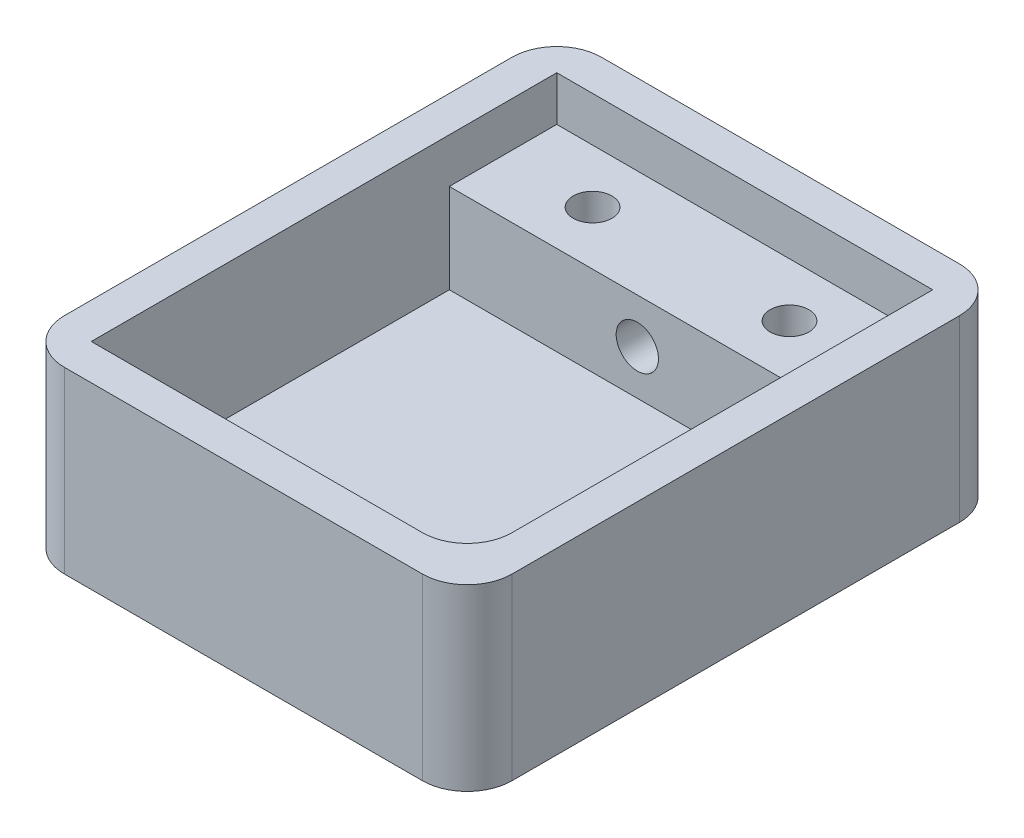
ISO-10303-21;
HEADER;
FILE_DESCRIPTION(('STEP AP214'),'2;1');
FILE_NAME('part.step','',(''),(''),'','','');
FILE_SCHEMA(('AUTOMOTIVE_DESIGN { 1 0 10303 214 1 1 1 1 }'));
ENDSEC;
DATA;
#1=APPLICATION_CONTEXT('core data for automotive mechanical design processes');
#2=APPLICATION_PROTOCOL_DEFINITION('international standard','automotive_design',2000,#1);
#3=PRODUCT_CONTEXT('',#1,'mechanical');
#4=PRODUCT('Part','Part','',(#3));
#5=PRODUCT_RELATED_PRODUCT_CATEGORY('part','',(#4));
#6=PRODUCT_DEFINITION_FORMATION('','',#4);
#7=PRODUCT_DEFINITION_CONTEXT('part definition',#1,'design');
#8=PRODUCT_DEFINITION('design','',#6,#7);
#9=PRODUCT_DEFINITION_SHAPE('','',#8);
#10=(LENGTH_UNIT() NAMED_UNIT(*) SI_UNIT(.MILLI.,.METRE.));
#11=(NAMED_UNIT(*) PLANE_ANGLE_UNIT() SI_UNIT($,.RADIAN.));
#12=(NAMED_UNIT(*) SI_UNIT($,.STERADIAN.) SOLID_ANGLE_UNIT());
#13=UNCERTAINTY_MEASURE_WITH_UNIT(LENGTH_MEASURE(1.E-05),#10,'distance_accuracy_value','');
#14=(GEOMETRIC_REPRESENTATION_CONTEXT(3) GLOBAL_UNCERTAINTY_ASSIGNED_CONTEXT((#13)) GLOBAL_UNIT_ASSIGNED_CONTEXT((#10,
#11,#12)) REPRESENTATION_CONTEXT('',''));
#15=CARTESIAN_POINT('',(0.,0.,0.));
#16=DIRECTION('',(0.,0.,1.));
#17=DIRECTION('',(1.,0.,0.));
#18=AXIS2_PLACEMENT_3D('',#15,#16,#17);
#19=CARTESIAN_POINT('',(13.335,12.7,16.51));
#20=DIRECTION('',(-1.,0.,0.));
#21=DIRECTION('',(0.,0.,1.));
#22=AXIS2_PLACEMENT_3D('',#19,#20,#21);
#23=PLANE('',#22);
#24=DIRECTION('',(0.,0.,-1.));
#25=VECTOR('',#24,1.);
#26=CARTESIAN_POINT('',(13.335,3.175,16.51));
#27=LINE('',#26,#25);
#28=CARTESIAN_POINT('',(13.335,3.175,13.335));
#29=VERTEX_POINT('',#28);
#30=CARTESIAN_POINT('',(13.335,3.175,-8.89000000000001));
#31=VERTEX_POINT('',#30);
#32=EDGE_CURVE('E142',#29,#31,#27,.T.);
#33=ORIENTED_EDGE('',*,*,#32,.F.);
#34=DIRECTION('',(0.,-1.,0.));
#35=VECTOR('',#34,1.);
#36=CARTESIAN_POINT('',(13.335,12.7,13.335));
#37=LINE('',#36,#35);
#38=CARTESIAN_POINT('',(13.335,12.7,13.335));
#39=VERTEX_POINT('',#38);
#40=EDGE_CURVE('E298',#29,#39,#37,.F.);
#41=ORIENTED_EDGE('',*,*,#40,.T.);
#42=DIRECTION('',(0.,0.,-1.));
#43=VECTOR('',#42,1.);
#44=CARTESIAN_POINT('',(13.335,12.7,16.51));
#45=LINE('',#44,#43);
#46=CARTESIAN_POINT('',(13.335,12.7,-16.51));
#47=VERTEX_POINT('',#46);
#48=EDGE_CURVE('E183',#39,#47,#45,.T.);
#49=ORIENTED_EDGE('',*,*,#48,.T.);
#50=DIRECTION('',(0.,-1.,0.));
#51=VECTOR('',#50,1.);
#52=CARTESIAN_POINT('',(13.335,12.7,-16.51));
#53=LINE('',#52,#51);
#54=CARTESIAN_POINT('',(13.335,9.525,-16.51));
#55=VERTEX_POINT('',#54);
#56=EDGE_CURVE('E210',#47,#55,#53,.T.);
#57=ORIENTED_EDGE('',*,*,#56,.T.);
#58=DIRECTION('',(0.,0.,-1.));
#59=VECTOR('',#58,1.);
#60=CARTESIAN_POINT('',(13.335,9.525,-16.51));
#61=LINE('',#60,#59);
#62=CARTESIAN_POINT('',(13.335,9.525,-8.89000000000001));
#63=VERTEX_POINT('',#62);
#64=EDGE_CURVE('E157',#63,#55,#61,.T.);
#65=ORIENTED_EDGE('',*,*,#64,.F.);
#66=DIRECTION('',(0.,-1.,0.));
#67=VECTOR('',#66,1.);
#68=CARTESIAN_POINT('',(13.335,9.525,-8.89000000000001));
#69=LINE('',#68,#67);
#70=EDGE_CURVE('E154',#63,#31,#69,.T.);
#71=ORIENTED_EDGE('',*,*,#70,.T.);
#72=EDGE_LOOP('',(#33,#41,#49,#57,#65,#71));
#73=FACE_BOUND('',#72,.T.);
#74=ADVANCED_FACE('F38',(#73),#23,.T.);
#75=CARTESIAN_POINT('',(-13.335,12.7,16.51));
#76=DIRECTION('',(1.,0.,0.));
#77=DIRECTION('',(0.,0.,-1.));
#78=AXIS2_PLACEMENT_3D('',#75,#76,#77);
#79=PLANE('',#78);
#80=DIRECTION('',(0.,0.,1.));
#81=VECTOR('',#80,1.);
#82=CARTESIAN_POINT('',(-13.335,3.175,16.51));
#83=LINE('',#82,#81);
#84=CARTESIAN_POINT('',(-13.335,3.175,-8.89000000000001));
#85=VERTEX_POINT('',#84);
#86=CARTESIAN_POINT('',(-13.335,3.175,16.51));
#87=VERTEX_POINT('',#86);
#88=EDGE_CURVE('E150',#85,#87,#83,.T.);
#89=ORIENTED_EDGE('',*,*,#88,.F.);
#90=DIRECTION('',(0.,-1.,0.));
#91=VECTOR('',#90,1.);
#92=CARTESIAN_POINT('',(-13.335,9.525,-8.89000000000001));
#93=LINE('',#92,#91);
#94=CARTESIAN_POINT('',(-13.335,9.525,-8.89000000000001));
#95=VERTEX_POINT('',#94);
#96=EDGE_CURVE('E151',#95,#85,#93,.T.);
#97=ORIENTED_EDGE('',*,*,#96,.F.);
#98=DIRECTION('',(0.,0.,1.));
#99=VECTOR('',#98,1.);
#100=CARTESIAN_POINT('',(-13.335,9.525,-16.51));
#101=LINE('',#100,#99);
#102=CARTESIAN_POINT('',(-13.335,9.525,-16.51));
#103=VERTEX_POINT('',#102);
#104=EDGE_CURVE('E167',#103,#95,#101,.T.);
#105=ORIENTED_EDGE('',*,*,#104,.F.);
#106=DIRECTION('',(0.,-1.,0.));
#107=VECTOR('',#106,1.);
#108=CARTESIAN_POINT('',(-13.335,12.7,-16.51));
#109=LINE('',#108,#107);
#110=CARTESIAN_POINT('',(-13.335,12.7,-16.51));
#111=VERTEX_POINT('',#110);
#112=EDGE_CURVE('E206',#111,#103,#109,.T.);
#113=ORIENTED_EDGE('',*,*,#112,.F.);
#114=DIRECTION('',(0.,0.,1.));
#115=VECTOR('',#114,1.);
#116=CARTESIAN_POINT('',(-13.335,12.7,16.51));
#117=LINE('',#116,#115);
#118=CARTESIAN_POINT('',(-13.335,12.7,16.51));
#119=VERTEX_POINT('',#118);
#120=EDGE_CURVE('E190',#111,#119,#117,.T.);
#121=ORIENTED_EDGE('',*,*,#120,.T.);
#122=DIRECTION('',(0.,-1.,0.));
#123=VECTOR('',#122,1.);
#124=CARTESIAN_POINT('',(-13.335,12.7,16.51));
#125=LINE('',#124,#123);
#126=EDGE_CURVE('E197',#119,#87,#125,.T.);
#127=ORIENTED_EDGE('',*,*,#126,.T.);
#128=EDGE_LOOP('',(#89,#97,#105,#113,#121,#127));
#129=FACE_BOUND('',#128,.T.);
#130=ADVANCED_FACE('F357',(#129),#79,.T.);
#131=CARTESIAN_POINT('',(0.,3.175,0.));
#132=DIRECTION('',(0.,-1.,0.));
#133=DIRECTION('',(0.,0.,-1.));
#134=AXIS2_PLACEMENT_3D('',#131,#132,#133);
#135=PLANE('',#134);
#136=DIRECTION('',(1.,0.,0.));
#137=VECTOR('',#136,1.);
#138=CARTESIAN_POINT('',(-13.335,3.175,16.51));
#139=LINE('',#138,#137);
#140=CARTESIAN_POINT('',(10.16,3.175,16.51));
#141=VERTEX_POINT('',#140);
#142=EDGE_CURVE('E187',#87,#141,#139,.T.);
#143=ORIENTED_EDGE('',*,*,#142,.T.);
#144=CARTESIAN_POINT('',(10.16,3.175,13.335));
#145=DIRECTION('',(0.,-1.,0.));
#146=DIRECTION('',(0.,0.,-1.));
#147=AXIS2_PLACEMENT_3D('',#144,#145,#146);
#148=CIRCLE('',#147,3.175);
#149=EDGE_CURVE('E54',#141,#29,#148,.F.);
#150=ORIENTED_EDGE('',*,*,#149,.T.);
#151=ORIENTED_EDGE('',*,*,#32,.T.);
#152=DIRECTION('',(1.,0.,0.));
#153=VECTOR('',#152,1.);
#154=CARTESIAN_POINT('',(-13.335,3.175,-8.89000000000001));
#155=LINE('',#154,#153);
#156=EDGE_CURVE('E146',#85,#31,#155,.T.);
#157=ORIENTED_EDGE('',*,*,#156,.F.);
#158=ORIENTED_EDGE('',*,*,#88,.T.);
#159=EDGE_LOOP('',(#143,#150,#151,#157,#158));
#160=FACE_BOUND('',#159,.T.);
#161=ADVANCED_FACE('F144',(#160),#135,.F.);
#162=CARTESIAN_POINT('',(15.875,3.175,19.05));
#163=DIRECTION('',(-1.,0.,0.));
#164=DIRECTION('',(0.,0.,1.));
#165=AXIS2_PLACEMENT_3D('',#162,#163,#164);
#166=PLANE('',#165);
#167=DIRECTION('',(0.,0.,-1.));
#168=VECTOR('',#167,1.);
#169=CARTESIAN_POINT('',(15.875,12.7,19.05));
#170=LINE('',#169,#168);
#171=CARTESIAN_POINT('',(15.875,12.7,15.875));
#172=VERTEX_POINT('',#171);
#173=CARTESIAN_POINT('',(15.875,12.7,-15.875));
#174=VERTEX_POINT('',#173);
#175=EDGE_CURVE('E217',#172,#174,#170,.T.);
#176=ORIENTED_EDGE('',*,*,#175,.F.);
#177=DIRECTION('',(0.,-1.,0.));
#178=VECTOR('',#177,1.);
#179=CARTESIAN_POINT('',(15.875,3.175,15.875));
#180=LINE('',#179,#178);
#181=CARTESIAN_POINT('',(15.875,0.,15.875));
#182=VERTEX_POINT('',#181);
#183=EDGE_CURVE('E258',#172,#182,#180,.T.);
#184=ORIENTED_EDGE('',*,*,#183,.T.);
#185=DIRECTION('',(0.,0.,-1.));
#186=VECTOR('',#185,1.);
#187=CARTESIAN_POINT('',(15.875,0.,19.05));
#188=LINE('',#187,#186);
#189=CARTESIAN_POINT('',(15.875,0.,-15.875));
#190=VERTEX_POINT('',#189);
#191=EDGE_CURVE('E229',#182,#190,#188,.T.);
#192=ORIENTED_EDGE('',*,*,#191,.T.);
#193=DIRECTION('',(0.,-1.,0.));
#194=VECTOR('',#193,1.);
#195=CARTESIAN_POINT('',(15.875,3.175,-15.875));
#196=LINE('',#195,#194);
#197=EDGE_CURVE('E245',#190,#174,#196,.F.);
#198=ORIENTED_EDGE('',*,*,#197,.T.);
#199=EDGE_LOOP('',(#176,#184,#192,#198));
#200=FACE_BOUND('',#199,.T.);
#201=ADVANCED_FACE('F349',(#200),#166,.F.);
#202=CARTESIAN_POINT('',(-15.875,3.175,-19.05));
#203=DIRECTION('',(0.,0.,1.));
#204=DIRECTION('',(1.,0.,0.));
#205=AXIS2_PLACEMENT_3D('',#202,#203,#204);
#206=PLANE('',#205);
#207=CARTESIAN_POINT('',(0.,6.35,-19.05));
#208=DIRECTION('',(0.,0.,1.));
#209=DIRECTION('',(1.,0.,0.));
#210=AXIS2_PLACEMENT_3D('',#207,#208,#209);
#211=CIRCLE('',#210,1.5);
#212=CARTESIAN_POINT('',(1.5,6.35,-19.05));
#213=VERTEX_POINT('',#212);
#214=EDGE_CURVE('E602',#213,#213,#211,.T.);
#215=ORIENTED_EDGE('',*,*,#214,.T.);
#216=EDGE_LOOP('',(#215));
#217=FACE_BOUND('',#216,.T.);
#218=DIRECTION('',(-1.,0.,0.));
#219=VECTOR('',#218,1.);
#220=CARTESIAN_POINT('',(-15.875,0.,-19.05));
#221=LINE('',#220,#219);
#222=CARTESIAN_POINT('',(12.7,0.,-19.05));
#223=VERTEX_POINT('',#222);
#224=CARTESIAN_POINT('',(-12.7,0.,-19.05));
#225=VERTEX_POINT('',#224);
#226=EDGE_CURVE('E233',#223,#225,#221,.T.);
#227=ORIENTED_EDGE('',*,*,#226,.T.);
#228=DIRECTION('',(0.,-1.,0.));
#229=VECTOR('',#228,1.);
#230=CARTESIAN_POINT('',(-12.7,3.175,-19.05));
#231=LINE('',#230,#229);
#232=CARTESIAN_POINT('',(-12.7,12.7,-19.05));
#233=VERTEX_POINT('',#232);
#234=EDGE_CURVE('E47',#225,#233,#231,.F.);
#235=ORIENTED_EDGE('',*,*,#234,.T.);
#236=DIRECTION('',(-1.,0.,0.));
#237=VECTOR('',#236,1.);
#238=CARTESIAN_POINT('',(15.875,12.7,-19.05));
#239=LINE('',#238,#237);
#240=CARTESIAN_POINT('',(12.7,12.7,-19.05));
#241=VERTEX_POINT('',#240);
#242=EDGE_CURVE('E221',#241,#233,#239,.T.);
#243=ORIENTED_EDGE('',*,*,#242,.F.);
#244=DIRECTION('',(0.,-1.,0.));
#245=VECTOR('',#244,1.);
#246=CARTESIAN_POINT('',(12.7,3.175,-19.05));
#247=LINE('',#246,#245);
#248=EDGE_CURVE('E308',#241,#223,#247,.T.);
#249=ORIENTED_EDGE('',*,*,#248,.T.);
#250=EDGE_LOOP('',(#227,#235,#243,#249));
#251=FACE_BOUND('',#250,.T.);
#252=ADVANCED_FACE('F315',(#217,#251),#206,.F.);
#253=CARTESIAN_POINT('',(-15.875,3.175,19.05));
#254=DIRECTION('',(1.,0.,0.));
#255=DIRECTION('',(0.,0.,-1.));
#256=AXIS2_PLACEMENT_3D('',#253,#254,#255);
#257=PLANE('',#256);
#258=DIRECTION('',(0.,0.,1.));
#259=VECTOR('',#258,1.);
#260=CARTESIAN_POINT('',(-15.875,0.,19.05));
#261=LINE('',#260,#259);
#262=CARTESIAN_POINT('',(-15.875,0.,-15.875));
#263=VERTEX_POINT('',#262);
#264=CARTESIAN_POINT('',(-15.875,0.,15.875));
#265=VERTEX_POINT('',#264);
#266=EDGE_CURVE('E237',#263,#265,#261,.T.);
#267=ORIENTED_EDGE('',*,*,#266,.T.);
#268=DIRECTION('',(0.,-1.,0.));
#269=VECTOR('',#268,1.);
#270=CARTESIAN_POINT('',(-15.875,3.175,15.875));
#271=LINE('',#270,#269);
#272=CARTESIAN_POINT('',(-15.875,12.7,15.875));
#273=VERTEX_POINT('',#272);
#274=EDGE_CURVE('E305',#265,#273,#271,.F.);
#275=ORIENTED_EDGE('',*,*,#274,.T.);
#276=DIRECTION('',(0.,0.,1.));
#277=VECTOR('',#276,1.);
#278=CARTESIAN_POINT('',(-15.875,12.7,-19.05));
#279=LINE('',#278,#277);
#280=CARTESIAN_POINT('',(-15.875,12.7,-15.875));
#281=VERTEX_POINT('',#280);
#282=EDGE_CURVE('E225',#281,#273,#279,.T.);
#283=ORIENTED_EDGE('',*,*,#282,.F.);
#284=DIRECTION('',(0.,-1.,0.));
#285=VECTOR('',#284,1.);
#286=CARTESIAN_POINT('',(-15.875,3.175,-15.875));
#287=LINE('',#286,#285);
#288=EDGE_CURVE('E301',#281,#263,#287,.T.);
#289=ORIENTED_EDGE('',*,*,#288,.T.);
#290=EDGE_LOOP('',(#267,#275,#283,#289));
#291=FACE_BOUND('',#290,.T.);
#292=ADVANCED_FACE('F329',(#291),#257,.F.);
#293=CARTESIAN_POINT('',(-15.875,3.175,19.05));
#294=DIRECTION('',(0.,0.,-1.));
#295=DIRECTION('',(-1.,0.,0.));
#296=AXIS2_PLACEMENT_3D('',#293,#294,#295);
#297=PLANE('',#296);
#298=DIRECTION('',(1.,0.,0.));
#299=VECTOR('',#298,1.);
#300=CARTESIAN_POINT('',(-15.875,0.,19.05));
#301=LINE('',#300,#299);
#302=CARTESIAN_POINT('',(-12.7,0.,19.05));
#303=VERTEX_POINT('',#302);
#304=CARTESIAN_POINT('',(12.7,0.,19.05));
#305=VERTEX_POINT('',#304);
#306=EDGE_CURVE('E241',#303,#305,#301,.T.);
#307=ORIENTED_EDGE('',*,*,#306,.T.);
#308=DIRECTION('',(0.,-1.,0.));
#309=VECTOR('',#308,1.);
#310=CARTESIAN_POINT('',(12.7,3.175,19.05));
#311=LINE('',#310,#309);
#312=CARTESIAN_POINT('',(12.7,12.7,19.05));
#313=VERTEX_POINT('',#312);
#314=EDGE_CURVE('E278',#305,#313,#311,.F.);
#315=ORIENTED_EDGE('',*,*,#314,.T.);
#316=DIRECTION('',(1.,0.,0.));
#317=VECTOR('',#316,1.);
#318=CARTESIAN_POINT('',(-15.875,12.7,19.05));
#319=LINE('',#318,#317);
#320=CARTESIAN_POINT('',(-12.7,12.7,19.05));
#321=VERTEX_POINT('',#320);
#322=EDGE_CURVE('E213',#321,#313,#319,.T.);
#323=ORIENTED_EDGE('',*,*,#322,.F.);
#324=DIRECTION('',(0.,-1.,0.));
#325=VECTOR('',#324,1.);
#326=CARTESIAN_POINT('',(-12.7,3.175,19.05));
#327=LINE('',#326,#325);
#328=EDGE_CURVE('E274',#321,#303,#327,.T.);
#329=ORIENTED_EDGE('',*,*,#328,.T.);
#330=EDGE_LOOP('',(#307,#315,#323,#329));
#331=FACE_BOUND('',#330,.T.);
#332=ADVANCED_FACE('F341',(#331),#297,.F.);
#333=CARTESIAN_POINT('',(0.,0.,0.));
#334=DIRECTION('',(0.,-1.,0.));
#335=DIRECTION('',(0.,0.,-1.));
#336=AXIS2_PLACEMENT_3D('',#333,#334,#335);
#337=PLANE('',#336);
#338=CARTESIAN_POINT('',(-6.985,0.,-12.7));
#339=DIRECTION('',(0.,-1.,0.));
#340=DIRECTION('',(0.,0.,-1.));
#341=AXIS2_PLACEMENT_3D('',#338,#339,#340);
#342=CIRCLE('',#341,2.749999961);
#343=CARTESIAN_POINT('',(-6.985,0.,-15.449999961));
#344=VERTEX_POINT('',#343);
#345=EDGE_CURVE('E176',#344,#344,#342,.T.);
#346=ORIENTED_EDGE('',*,*,#345,.F.);
#347=EDGE_LOOP('',(#346));
#348=FACE_BOUND('',#347,.T.);
#349=CARTESIAN_POINT('',(6.985,0.,-12.7));
#350=DIRECTION('',(0.,-1.,0.));
#351=DIRECTION('',(0.,0.,-1.));
#352=AXIS2_PLACEMENT_3D('',#349,#350,#351);
#353=CIRCLE('',#352,2.749999961);
#354=CARTESIAN_POINT('',(6.985,0.,-15.449999961));
#355=VERTEX_POINT('',#354);
#356=EDGE_CURVE('E255',#355,#355,#353,.T.);
#357=ORIENTED_EDGE('',*,*,#356,.F.);
#358=EDGE_LOOP('',(#357));
#359=FACE_BOUND('',#358,.T.);
#360=ORIENTED_EDGE('',*,*,#191,.F.);
#361=CARTESIAN_POINT('',(12.7,0.,15.875));
#362=DIRECTION('',(0.,-1.,0.));
#363=DIRECTION('',(0.,0.,-1.));
#364=AXIS2_PLACEMENT_3D('',#361,#362,#363);
#365=CIRCLE('',#364,3.175);
#366=EDGE_CURVE('E271',#182,#305,#365,.T.);
#367=ORIENTED_EDGE('',*,*,#366,.T.);
#368=ORIENTED_EDGE('',*,*,#306,.F.);
#369=CARTESIAN_POINT('',(-12.7,0.,15.875));
#370=DIRECTION('',(0.,-1.,0.));
#371=DIRECTION('',(0.,0.,-1.));
#372=AXIS2_PLACEMENT_3D('',#369,#370,#371);
#373=CIRCLE('',#372,3.175);
#374=EDGE_CURVE('E268',#303,#265,#373,.T.);
#375=ORIENTED_EDGE('',*,*,#374,.T.);
#376=ORIENTED_EDGE('',*,*,#266,.F.);
#377=CARTESIAN_POINT('',(-12.7,0.,-15.875));
#378=DIRECTION('',(0.,-1.,0.));
#379=DIRECTION('',(0.,0.,-1.));
#380=AXIS2_PLACEMENT_3D('',#377,#378,#379);
#381=CIRCLE('',#380,3.175);
#382=EDGE_CURVE('E265',#263,#225,#381,.T.);
#383=ORIENTED_EDGE('',*,*,#382,.T.);
#384=ORIENTED_EDGE('',*,*,#226,.F.);
#385=CARTESIAN_POINT('',(12.7,0.,-15.875));
#386=DIRECTION('',(0.,-1.,0.));
#387=DIRECTION('',(0.,0.,-1.));
#388=AXIS2_PLACEMENT_3D('',#385,#386,#387);
#389=CIRCLE('',#388,3.175);
#390=EDGE_CURVE('E262',#223,#190,#389,.T.);
#391=ORIENTED_EDGE('',*,*,#390,.T.);
#392=EDGE_LOOP('',(#360,#367,#368,#375,#376,#383,#384,#391));
#393=FACE_BOUND('',#392,.T.);
#394=ADVANCED_FACE('F333',(#348,#359,#393),#337,.T.);
#395=CARTESIAN_POINT('',(0.,12.7,0.));
#396=DIRECTION('',(0.,1.,0.));
#397=DIRECTION('',(0.,0.,1.));
#398=AXIS2_PLACEMENT_3D('',#395,#396,#397);
#399=PLANE('',#398);
#400=ORIENTED_EDGE('',*,*,#322,.T.);
#401=CARTESIAN_POINT('',(12.7,12.7,15.875));
#402=DIRECTION('',(0.,1.,0.));
#403=DIRECTION('',(0.,0.,1.));
#404=AXIS2_PLACEMENT_3D('',#401,#402,#403);
#405=CIRCLE('',#404,3.175);
#406=EDGE_CURVE('E290',#313,#172,#405,.T.);
#407=ORIENTED_EDGE('',*,*,#406,.T.);
#408=ORIENTED_EDGE('',*,*,#175,.T.);
#409=CARTESIAN_POINT('',(12.7,12.7,-15.875));
#410=DIRECTION('',(0.,1.,0.));
#411=DIRECTION('',(0.,0.,1.));
#412=AXIS2_PLACEMENT_3D('',#409,#410,#411);
#413=CIRCLE('',#412,3.175);
#414=EDGE_CURVE('E281',#174,#241,#413,.T.);
#415=ORIENTED_EDGE('',*,*,#414,.T.);
#416=ORIENTED_EDGE('',*,*,#242,.T.);
#417=CARTESIAN_POINT('',(-12.7,12.7,-15.875));
#418=DIRECTION('',(0.,1.,0.));
#419=DIRECTION('',(0.,0.,1.));
#420=AXIS2_PLACEMENT_3D('',#417,#418,#419);
#421=CIRCLE('',#420,3.175);
#422=EDGE_CURVE('E284',#233,#281,#421,.T.);
#423=ORIENTED_EDGE('',*,*,#422,.T.);
#424=ORIENTED_EDGE('',*,*,#282,.T.);
#425=CARTESIAN_POINT('',(-12.7,12.7,15.875));
#426=DIRECTION('',(0.,1.,0.));
#427=DIRECTION('',(0.,0.,1.));
#428=AXIS2_PLACEMENT_3D('',#425,#426,#427);
#429=CIRCLE('',#428,3.175);
#430=EDGE_CURVE('E287',#273,#321,#429,.T.);
#431=ORIENTED_EDGE('',*,*,#430,.T.);
#432=EDGE_LOOP('',(#400,#407,#408,#415,#416,#423,#424,#431));
#433=FACE_BOUND('',#432,.T.);
#434=DIRECTION('',(-1.,0.,0.));
#435=VECTOR('',#434,1.);
#436=CARTESIAN_POINT('',(-13.335,12.7,-16.51));
#437=LINE('',#436,#435);
#438=EDGE_CURVE('E186',#47,#111,#437,.T.);
#439=ORIENTED_EDGE('',*,*,#438,.F.);
#440=ORIENTED_EDGE('',*,*,#48,.F.);
#441=CARTESIAN_POINT('',(10.16,12.7,13.335));
#442=DIRECTION('',(0.,1.,0.));
#443=DIRECTION('',(0.,0.,1.));
#444=AXIS2_PLACEMENT_3D('',#441,#442,#443);
#445=CIRCLE('',#444,3.175);
#446=CARTESIAN_POINT('',(10.16,12.7,16.51));
#447=VERTEX_POINT('',#446);
#448=EDGE_CURVE('E11',#39,#447,#445,.F.);
#449=ORIENTED_EDGE('',*,*,#448,.T.);
#450=DIRECTION('',(1.,0.,0.));
#451=VECTOR('',#450,1.);
#452=CARTESIAN_POINT('',(-13.335,12.7,16.51));
#453=LINE('',#452,#451);
#454=EDGE_CURVE('E194',#119,#447,#453,.T.);
#455=ORIENTED_EDGE('',*,*,#454,.F.);
#456=ORIENTED_EDGE('',*,*,#120,.F.);
#457=EDGE_LOOP('',(#439,#440,#449,#455,#456));
#458=FACE_BOUND('',#457,.T.);
#459=ADVANCED_FACE('F321',(#433,#458),#399,.T.);
#460=CARTESIAN_POINT('',(-13.335,12.7,-16.51));
#461=DIRECTION('',(0.,0.,1.));
#462=DIRECTION('',(1.,0.,0.));
#463=AXIS2_PLACEMENT_3D('',#460,#461,#462);
#464=PLANE('',#463);
#465=DIRECTION('',(-1.,0.,0.));
#466=VECTOR('',#465,1.);
#467=CARTESIAN_POINT('',(-13.335,9.525,-16.51));
#468=LINE('',#467,#466);
#469=EDGE_CURVE('E162',#55,#103,#468,.T.);
#470=ORIENTED_EDGE('',*,*,#469,.F.);
#471=ORIENTED_EDGE('',*,*,#56,.F.);
#472=ORIENTED_EDGE('',*,*,#438,.T.);
#473=ORIENTED_EDGE('',*,*,#112,.T.);
#474=EDGE_LOOP('',(#470,#471,#472,#473));
#475=FACE_BOUND('',#474,.T.);
#476=ADVANCED_FACE('F368',(#475),#464,.T.);
#477=CARTESIAN_POINT('',(-13.335,12.7,16.51));
#478=DIRECTION('',(0.,0.,-1.));
#479=DIRECTION('',(-1.,0.,0.));
#480=AXIS2_PLACEMENT_3D('',#477,#478,#479);
#481=PLANE('',#480);
#482=ORIENTED_EDGE('',*,*,#454,.T.);
#483=DIRECTION('',(0.,-1.,0.));
#484=VECTOR('',#483,1.);
#485=CARTESIAN_POINT('',(10.16,3.175,16.51));
#486=LINE('',#485,#484);
#487=EDGE_CURVE('E293',#447,#141,#486,.T.);
#488=ORIENTED_EDGE('',*,*,#487,.T.);
#489=ORIENTED_EDGE('',*,*,#142,.F.);
#490=ORIENTED_EDGE('',*,*,#126,.F.);
#491=EDGE_LOOP('',(#482,#488,#489,#490));
#492=FACE_BOUND('',#491,.T.);
#493=ADVANCED_FACE('F496',(#492),#481,.T.);
#494=CARTESIAN_POINT('',(-13.335,9.525,-8.89000000000001));
#495=DIRECTION('',(0.,0.,-1.));
#496=DIRECTION('',(-1.,0.,0.));
#497=AXIS2_PLACEMENT_3D('',#494,#495,#496);
#498=PLANE('',#497);
#499=CARTESIAN_POINT('',(0.,6.35,-8.89000000000001));
#500=DIRECTION('',(0.,0.,1.));
#501=DIRECTION('',(1.,0.,0.));
#502=AXIS2_PLACEMENT_3D('',#499,#500,#501);
#503=CIRCLE('',#502,1.5);
#504=CARTESIAN_POINT('',(1.5,6.35,-8.89000000000001));
#505=VERTEX_POINT('',#504);
#506=EDGE_CURVE('E606',#505,#505,#503,.T.);
#507=ORIENTED_EDGE('',*,*,#506,.F.);
#508=EDGE_LOOP('',(#507));
#509=FACE_BOUND('',#508,.T.);
#510=ORIENTED_EDGE('',*,*,#156,.T.);
#511=ORIENTED_EDGE('',*,*,#70,.F.);
#512=DIRECTION('',(1.,0.,0.));
#513=VECTOR('',#512,1.);
#514=CARTESIAN_POINT('',(-13.335,9.525,-8.89000000000001));
#515=LINE('',#514,#513);
#516=EDGE_CURVE('E173',#95,#63,#515,.T.);
#517=ORIENTED_EDGE('',*,*,#516,.F.);
#518=ORIENTED_EDGE('',*,*,#96,.T.);
#519=EDGE_LOOP('',(#510,#511,#517,#518));
#520=FACE_BOUND('',#519,.T.);
#521=ADVANCED_FACE('F165',(#509,#520),#498,.F.);
#522=CARTESIAN_POINT('',(0.,9.525,0.));
#523=DIRECTION('',(0.,1.,0.));
#524=DIRECTION('',(0.,0.,1.));
#525=AXIS2_PLACEMENT_3D('',#522,#523,#524);
#526=PLANE('',#525);
#527=CARTESIAN_POINT('',(6.985,9.525,-12.7));
#528=DIRECTION('',(0.,1.,0.));
#529=DIRECTION('',(0.,0.,1.));
#530=AXIS2_PLACEMENT_3D('',#527,#528,#529);
#531=CIRCLE('',#530,1.375);
#532=CARTESIAN_POINT('',(6.985,9.525,-11.325));
#533=VERTEX_POINT('',#532);
#534=EDGE_CURVE('E250',#533,#533,#531,.T.);
#535=ORIENTED_EDGE('',*,*,#534,.F.);
#536=EDGE_LOOP('',(#535));
#537=FACE_BOUND('',#536,.T.);
#538=CARTESIAN_POINT('',(-6.985,9.525,-12.7));
#539=DIRECTION('',(0.,1.,0.));
#540=DIRECTION('',(0.,0.,1.));
#541=AXIS2_PLACEMENT_3D('',#538,#539,#540);
#542=CIRCLE('',#541,1.375);
#543=CARTESIAN_POINT('',(-6.985,9.525,-11.325));
#544=VERTEX_POINT('',#543);
#545=EDGE_CURVE('E246',#544,#544,#542,.T.);
#546=ORIENTED_EDGE('',*,*,#545,.F.);
#547=EDGE_LOOP('',(#546));
#548=FACE_BOUND('',#547,.T.);
#549=ORIENTED_EDGE('',*,*,#104,.T.);
#550=ORIENTED_EDGE('',*,*,#516,.T.);
#551=ORIENTED_EDGE('',*,*,#64,.T.);
#552=ORIENTED_EDGE('',*,*,#469,.T.);
#553=EDGE_LOOP('',(#549,#550,#551,#552));
#554=FACE_BOUND('',#553,.T.);
#555=ADVANCED_FACE('F480',(#537,#548,#554),#526,.T.);
#556=CARTESIAN_POINT('',(6.985,6.35,-12.7));
#557=DIRECTION('',(0.,-1.,0.));
#558=DIRECTION('',(0.,0.,-1.));
#559=AXIS2_PLACEMENT_3D('',#556,#557,#558);
#560=CYLINDRICAL_SURFACE('',#559,2.749999961);
#561=CARTESIAN_POINT('',(6.985,6.35,-12.7));
#562=DIRECTION('',(0.,-1.,0.));
#563=DIRECTION('',(0.,0.,-1.));
#564=AXIS2_PLACEMENT_3D('',#561,#562,#563);
#565=CIRCLE('',#564,2.749999961);
#566=CARTESIAN_POINT('',(6.985,6.35,-15.449999961));
#567=VERTEX_POINT('',#566);
#568=EDGE_CURVE('E591',#567,#567,#565,.T.);
#569=ORIENTED_EDGE('',*,*,#568,.F.);
#570=EDGE_LOOP('',(#569));
#571=FACE_BOUND('',#570,.T.);
#572=ORIENTED_EDGE('',*,*,#356,.T.);
#573=EDGE_LOOP('',(#572));
#574=FACE_BOUND('',#573,.T.);
#575=ADVANCED_FACE('F472',(#571,#574),#560,.F.);
#576=CARTESIAN_POINT('',(6.985,6.35,-12.7));
#577=DIRECTION('',(0.,-1.,0.));
#578=DIRECTION('',(0.,0.,-1.));
#579=AXIS2_PLACEMENT_3D('',#576,#577,#578);
#580=PLANE('',#579);
#581=CARTESIAN_POINT('',(6.985,6.35,-12.7));
#582=DIRECTION('',(0.,-1.,0.));
#583=DIRECTION('',(0.,0.,-1.));
#584=AXIS2_PLACEMENT_3D('',#581,#582,#583);
#585=CIRCLE('',#584,1.375);
#586=CARTESIAN_POINT('',(6.985,6.35,-14.075));
#587=VERTEX_POINT('',#586);
#588=EDGE_CURVE('E251',#587,#587,#585,.T.);
#589=ORIENTED_EDGE('',*,*,#588,.F.);
#590=EDGE_LOOP('',(#589));
#591=FACE_BOUND('',#590,.T.);
#592=ORIENTED_EDGE('',*,*,#568,.T.);
#593=EDGE_LOOP('',(#592));
#594=FACE_BOUND('',#593,.T.);
#595=ADVANCED_FACE('F462',(#591,#594),#580,.T.);
#596=CARTESIAN_POINT('',(-6.985,6.35,-12.7));
#597=DIRECTION('',(0.,-1.,0.));
#598=DIRECTION('',(0.,0.,-1.));
#599=AXIS2_PLACEMENT_3D('',#596,#597,#598);
#600=CYLINDRICAL_SURFACE('',#599,2.749999961);
#601=CARTESIAN_POINT('',(-6.985,6.35,-12.7));
#602=DIRECTION('',(0.,-1.,0.));
#603=DIRECTION('',(0.,0.,-1.));
#604=AXIS2_PLACEMENT_3D('',#601,#602,#603);
#605=CIRCLE('',#604,2.749999961);
#606=CARTESIAN_POINT('',(-6.985,6.35,-15.449999961));
#607=VERTEX_POINT('',#606);
#608=EDGE_CURVE('E168',#607,#607,#605,.T.);
#609=ORIENTED_EDGE('',*,*,#608,.F.);
#610=EDGE_LOOP('',(#609));
#611=FACE_BOUND('',#610,.T.);
#612=ORIENTED_EDGE('',*,*,#345,.T.);
#613=EDGE_LOOP('',(#612));
#614=FACE_BOUND('',#613,.T.);
#615=ADVANCED_FACE('F452',(#611,#614),#600,.F.);
#616=CARTESIAN_POINT('',(-6.985,6.35,-12.7));
#617=DIRECTION('',(0.,-1.,0.));
#618=DIRECTION('',(0.,0.,-1.));
#619=AXIS2_PLACEMENT_3D('',#616,#617,#618);
#620=PLANE('',#619);
#621=CARTESIAN_POINT('',(-6.985,6.35,-12.7));
#622=DIRECTION('',(0.,-1.,0.));
#623=DIRECTION('',(0.,0.,-1.));
#624=AXIS2_PLACEMENT_3D('',#621,#622,#623);
#625=CIRCLE('',#624,1.375);
#626=CARTESIAN_POINT('',(-6.985,6.35,-14.075));
#627=VERTEX_POINT('',#626);
#628=EDGE_CURVE('E598',#627,#627,#625,.T.);
#629=ORIENTED_EDGE('',*,*,#628,.F.);
#630=EDGE_LOOP('',(#629));
#631=FACE_BOUND('',#630,.T.);
#632=ORIENTED_EDGE('',*,*,#608,.T.);
#633=EDGE_LOOP('',(#632));
#634=FACE_BOUND('',#633,.T.);
#635=ADVANCED_FACE('F443',(#631,#634),#620,.T.);
#636=CARTESIAN_POINT('',(-6.985,12.7,-12.7));
#637=DIRECTION('',(0.,-1.,0.));
#638=DIRECTION('',(0.,0.,-1.));
#639=AXIS2_PLACEMENT_3D('',#636,#637,#638);
#640=CYLINDRICAL_SURFACE('',#639,1.375);
#641=ORIENTED_EDGE('',*,*,#545,.T.);
#642=EDGE_LOOP('',(#641));
#643=FACE_BOUND('',#642,.T.);
#644=ORIENTED_EDGE('',*,*,#628,.T.);
#645=EDGE_LOOP('',(#644));
#646=FACE_BOUND('',#645,.T.);
#647=ADVANCED_FACE('F434',(#643,#646),#640,.F.);
#648=CARTESIAN_POINT('',(6.985,12.7,-12.7));
#649=DIRECTION('',(0.,-1.,0.));
#650=DIRECTION('',(0.,0.,-1.));
#651=AXIS2_PLACEMENT_3D('',#648,#649,#650);
#652=CYLINDRICAL_SURFACE('',#651,1.375);
#653=ORIENTED_EDGE('',*,*,#534,.T.);
#654=EDGE_LOOP('',(#653));
#655=FACE_BOUND('',#654,.T.);
#656=ORIENTED_EDGE('',*,*,#588,.T.);
#657=EDGE_LOOP('',(#656));
#658=FACE_BOUND('',#657,.T.);
#659=ADVANCED_FACE('F424',(#655,#658),#652,.F.);
#660=CARTESIAN_POINT('',(0.,6.35,-19.05));
#661=DIRECTION('',(0.,0.,1.));
#662=DIRECTION('',(1.,0.,0.));
#663=AXIS2_PLACEMENT_3D('',#660,#661,#662);
#664=CYLINDRICAL_SURFACE('',#663,1.5);
#665=ORIENTED_EDGE('',*,*,#214,.F.);
#666=EDGE_LOOP('',(#665));
#667=FACE_BOUND('',#666,.T.);
#668=ORIENTED_EDGE('',*,*,#506,.T.);
#669=EDGE_LOOP('',(#668));
#670=FACE_BOUND('',#669,.T.);
#671=ADVANCED_FACE('F387',(#667,#670),#664,.F.);
#672=CARTESIAN_POINT('',(12.7,3.175,15.875));
#673=DIRECTION('',(0.,-1.,0.));
#674=DIRECTION('',(0.,0.,-1.));
#675=AXIS2_PLACEMENT_3D('',#672,#673,#674);
#676=CYLINDRICAL_SURFACE('',#675,3.175);
#677=ORIENTED_EDGE('',*,*,#406,.F.);
#678=ORIENTED_EDGE('',*,*,#314,.F.);
#679=ORIENTED_EDGE('',*,*,#366,.F.);
#680=ORIENTED_EDGE('',*,*,#183,.F.);
#681=EDGE_LOOP('',(#677,#678,#679,#680));
#682=FACE_BOUND('',#681,.T.);
#683=ADVANCED_FACE('F347',(#682),#676,.T.);
#684=CARTESIAN_POINT('',(10.16,12.7,13.335));
#685=DIRECTION('',(0.,1.,0.));
#686=DIRECTION('',(0.,0.,1.));
#687=AXIS2_PLACEMENT_3D('',#684,#685,#686);
#688=CYLINDRICAL_SURFACE('',#687,3.175);
#689=ORIENTED_EDGE('',*,*,#448,.F.);
#690=ORIENTED_EDGE('',*,*,#40,.F.);
#691=ORIENTED_EDGE('',*,*,#149,.F.);
#692=ORIENTED_EDGE('',*,*,#487,.F.);
#693=EDGE_LOOP('',(#689,#690,#691,#692));
#694=FACE_BOUND('',#693,.T.);
#695=ADVANCED_FACE('F386',(#694),#688,.F.);
#696=CARTESIAN_POINT('',(-12.7,3.175,15.875));
#697=DIRECTION('',(0.,-1.,0.));
#698=DIRECTION('',(0.,0.,-1.));
#699=AXIS2_PLACEMENT_3D('',#696,#697,#698);
#700=CYLINDRICAL_SURFACE('',#699,3.175);
#701=ORIENTED_EDGE('',*,*,#430,.F.);
#702=ORIENTED_EDGE('',*,*,#274,.F.);
#703=ORIENTED_EDGE('',*,*,#374,.F.);
#704=ORIENTED_EDGE('',*,*,#328,.F.);
#705=EDGE_LOOP('',(#701,#702,#703,#704));
#706=FACE_BOUND('',#705,.T.);
#707=ADVANCED_FACE('F338',(#706),#700,.T.);
#708=CARTESIAN_POINT('',(-12.7,3.175,-15.875));
#709=DIRECTION('',(0.,-1.,0.));
#710=DIRECTION('',(0.,0.,-1.));
#711=AXIS2_PLACEMENT_3D('',#708,#709,#710);
#712=CYLINDRICAL_SURFACE('',#711,3.175);
#713=ORIENTED_EDGE('',*,*,#422,.F.);
#714=ORIENTED_EDGE('',*,*,#234,.F.);
#715=ORIENTED_EDGE('',*,*,#382,.F.);
#716=ORIENTED_EDGE('',*,*,#288,.F.);
#717=EDGE_LOOP('',(#713,#714,#715,#716));
#718=FACE_BOUND('',#717,.T.);
#719=ADVANCED_FACE('F326',(#718),#712,.T.);
#720=CARTESIAN_POINT('',(12.7,3.175,-15.875));
#721=DIRECTION('',(0.,-1.,0.));
#722=DIRECTION('',(0.,0.,-1.));
#723=AXIS2_PLACEMENT_3D('',#720,#721,#722);
#724=CYLINDRICAL_SURFACE('',#723,3.175);
#725=ORIENTED_EDGE('',*,*,#414,.F.);
#726=ORIENTED_EDGE('',*,*,#197,.F.);
#727=ORIENTED_EDGE('',*,*,#390,.F.);
#728=ORIENTED_EDGE('',*,*,#248,.F.);
#729=EDGE_LOOP('',(#725,#726,#727,#728));
#730=FACE_BOUND('',#729,.T.);
#731=ADVANCED_FACE('F40',(#730),#724,.T.);
#732=CLOSED_SHELL('',(#74,#130,#161,#201,#252,#292,#332,#394,#459,#476,#493,#521,#555,#575,#595,
#615,#635,#647,#659,#671,#683,#695,#707,#719,#731));
#733=MANIFOLD_SOLID_BREP('B2',#732);
#734=ADVANCED_BREP_SHAPE_REPRESENTATION('',(#18,#733),#14);
#735=SHAPE_DEFINITION_REPRESENTATION(#9,#734);
ENDSEC;
END-ISO-10303-21;
